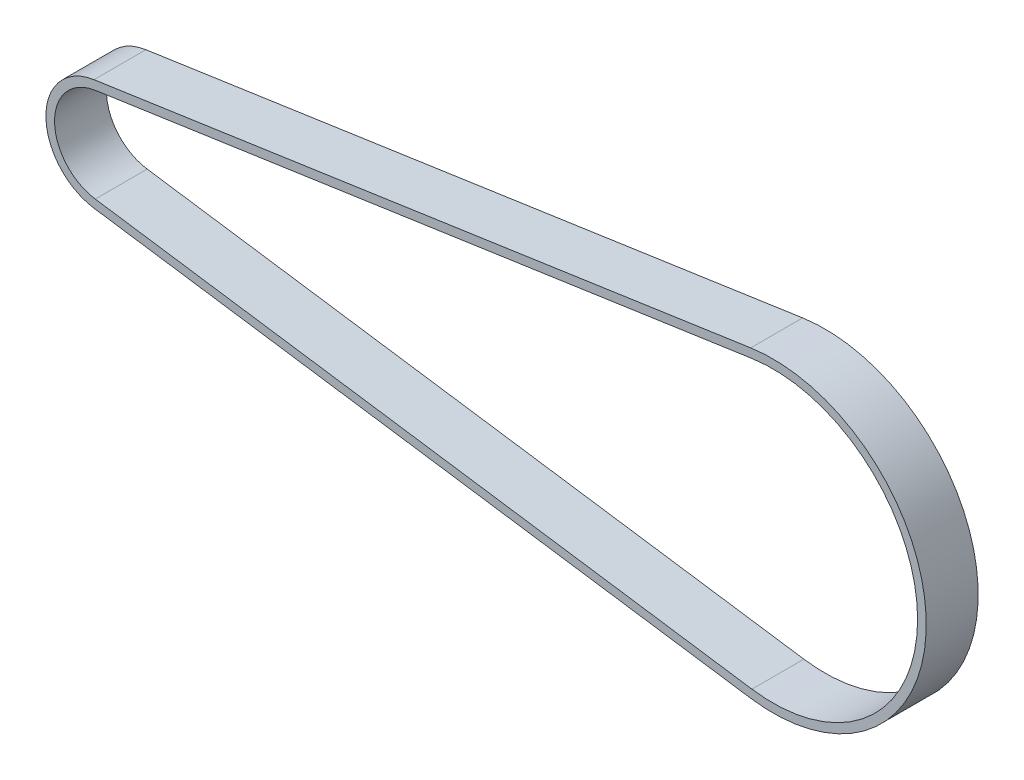
ISO-10303-21;
HEADER;
FILE_DESCRIPTION(('STEP AP214'),'2;1');
FILE_NAME('part.step','',(''),(''),'','','');
FILE_SCHEMA(('AUTOMOTIVE_DESIGN { 1 0 10303 214 1 1 1 1 }'));
ENDSEC;
DATA;
#1=APPLICATION_CONTEXT('core data for automotive mechanical design processes');
#2=APPLICATION_PROTOCOL_DEFINITION('international standard','automotive_design',2000,#1);
#3=PRODUCT_CONTEXT('',#1,'mechanical');
#4=PRODUCT('Part','Part','',(#3));
#5=PRODUCT_RELATED_PRODUCT_CATEGORY('part','',(#4));
#6=PRODUCT_DEFINITION_FORMATION('','',#4);
#7=PRODUCT_DEFINITION_CONTEXT('part definition',#1,'design');
#8=PRODUCT_DEFINITION('design','',#6,#7);
#9=PRODUCT_DEFINITION_SHAPE('','',#8);
#10=(LENGTH_UNIT() NAMED_UNIT(*) SI_UNIT(.MILLI.,.METRE.));
#11=(NAMED_UNIT(*) PLANE_ANGLE_UNIT() SI_UNIT($,.RADIAN.));
#12=(NAMED_UNIT(*) SI_UNIT($,.STERADIAN.) SOLID_ANGLE_UNIT());
#13=UNCERTAINTY_MEASURE_WITH_UNIT(LENGTH_MEASURE(1.E-05),#10,'distance_accuracy_value','');
#14=(GEOMETRIC_REPRESENTATION_CONTEXT(3) GLOBAL_UNCERTAINTY_ASSIGNED_CONTEXT((#13)) GLOBAL_UNIT_ASSIGNED_CONTEXT((#10,
#11,#12)) REPRESENTATION_CONTEXT('',''));
#15=CARTESIAN_POINT('',(0.,0.,0.));
#16=DIRECTION('',(0.,0.,1.));
#17=DIRECTION('',(1.,0.,0.));
#18=AXIS2_PLACEMENT_3D('',#15,#16,#17);
#19=CARTESIAN_POINT('',(0.,0.,6.));
#20=DIRECTION('',(0.,0.,1.));
#21=DIRECTION('',(1.,0.,0.));
#22=AXIS2_PLACEMENT_3D('',#19,#20,#21);
#23=PLANE('',#22);
#24=CARTESIAN_POINT('',(0.,0.,6.));
#25=DIRECTION('',(0.,0.,1.));
#26=DIRECTION('',(1.,0.,0.));
#27=AXIS2_PLACEMENT_3D('',#24,#25,#26);
#28=CIRCLE('',#27,6.5);
#29=CARTESIAN_POINT('',(-0.941032258064516,6.43152068248886,6.));
#30=VERTEX_POINT('',#29);
#31=CARTESIAN_POINT('',(-0.941032258064516,-6.43152068248886,6.));
#32=VERTEX_POINT('',#31);
#33=EDGE_CURVE('E153',#30,#32,#28,.T.);
#34=ORIENTED_EDGE('',*,*,#33,.T.);
#35=DIRECTION('',(0.989464720382902,-0.144774193548387,0.));
#36=VECTOR('',#35,1.);
#37=CARTESIAN_POINT('',(-0.941032258064516,-6.43152068248886,6.));
#38=LINE('',#37,#36);
#39=CARTESIAN_POINT('',(74.9346012903226,-17.533314845185,6.));
#40=VERTEX_POINT('',#39);
#41=EDGE_CURVE('E157',#32,#40,#38,.T.);
#42=ORIENTED_EDGE('',*,*,#41,.T.);
#43=CARTESIAN_POINT('',(77.5,0.,6.));
#44=DIRECTION('',(0.,0.,1.));
#45=DIRECTION('',(1.,0.,0.));
#46=AXIS2_PLACEMENT_3D('',#43,#44,#45);
#47=CIRCLE('',#46,17.72);
#48=CARTESIAN_POINT('',(74.9346012903226,17.533314845185,6.));
#49=VERTEX_POINT('',#48);
#50=EDGE_CURVE('E161',#40,#49,#47,.T.);
#51=ORIENTED_EDGE('',*,*,#50,.T.);
#52=DIRECTION('',(-0.989464720382902,-0.144774193548387,0.));
#53=VECTOR('',#52,1.);
#54=CARTESIAN_POINT('',(-0.941032258064516,6.43152068248886,6.));
#55=LINE('',#54,#53);
#56=EDGE_CURVE('E164',#49,#30,#55,.T.);
#57=ORIENTED_EDGE('',*,*,#56,.T.);
#58=EDGE_LOOP('',(#34,#42,#51,#57));
#59=FACE_BOUND('',#58,.T.);
#60=DIRECTION('',(0.989464720382902,-0.144774193548387,0.));
#61=VECTOR('',#60,1.);
#62=CARTESIAN_POINT('',(-0.796258064516129,-5.44205596210596,6.));
#63=LINE('',#62,#61);
#64=CARTESIAN_POINT('',(-0.796258064516129,-5.44205596210596,6.));
#65=VERTEX_POINT('',#64);
#66=CARTESIAN_POINT('',(75.079375483871,-16.5438501248021,6.));
#67=VERTEX_POINT('',#66);
#68=EDGE_CURVE('E114',#65,#67,#63,.T.);
#69=ORIENTED_EDGE('',*,*,#68,.F.);
#70=CARTESIAN_POINT('',(0.,0.,6.));
#71=DIRECTION('',(0.,0.,1.));
#72=DIRECTION('',(1.,0.,0.));
#73=AXIS2_PLACEMENT_3D('',#70,#71,#72);
#74=CIRCLE('',#73,5.5);
#75=CARTESIAN_POINT('',(-0.796258064516129,5.44205596210596,6.));
#76=VERTEX_POINT('',#75);
#77=EDGE_CURVE('E105',#76,#65,#74,.T.);
#78=ORIENTED_EDGE('',*,*,#77,.F.);
#79=DIRECTION('',(-0.989464720382902,-0.144774193548387,0.));
#80=VECTOR('',#79,1.);
#81=CARTESIAN_POINT('',(-0.796258064516129,5.44205596210596,6.));
#82=LINE('',#81,#80);
#83=CARTESIAN_POINT('',(75.079375483871,16.5438501248021,6.));
#84=VERTEX_POINT('',#83);
#85=EDGE_CURVE('E131',#84,#76,#82,.T.);
#86=ORIENTED_EDGE('',*,*,#85,.F.);
#87=CARTESIAN_POINT('',(77.5,0.,6.));
#88=DIRECTION('',(0.,0.,1.));
#89=DIRECTION('',(1.,0.,0.));
#90=AXIS2_PLACEMENT_3D('',#87,#88,#89);
#91=CIRCLE('',#90,16.72);
#92=EDGE_CURVE('E127',#67,#84,#91,.T.);
#93=ORIENTED_EDGE('',*,*,#92,.F.);
#94=EDGE_LOOP('',(#69,#78,#86,#93));
#95=FACE_BOUND('',#94,.T.);
#96=ADVANCED_FACE('F39',(#59,#95),#23,.T.);
#97=CARTESIAN_POINT('',(0.,0.,0.));
#98=DIRECTION('',(0.,0.,1.));
#99=DIRECTION('',(1.,0.,0.));
#100=AXIS2_PLACEMENT_3D('',#97,#98,#99);
#101=PLANE('',#100);
#102=CARTESIAN_POINT('',(0.,0.,0.));
#103=DIRECTION('',(0.,0.,1.));
#104=DIRECTION('',(1.,0.,0.));
#105=AXIS2_PLACEMENT_3D('',#102,#103,#104);
#106=CIRCLE('',#105,6.5);
#107=CARTESIAN_POINT('',(-0.941032258064516,6.43152068248886,0.));
#108=VERTEX_POINT('',#107);
#109=CARTESIAN_POINT('',(-0.941032258064516,-6.43152068248886,0.));
#110=VERTEX_POINT('',#109);
#111=EDGE_CURVE('E123',#108,#110,#106,.T.);
#112=ORIENTED_EDGE('',*,*,#111,.F.);
#113=DIRECTION('',(-0.989464720382902,-0.144774193548387,0.));
#114=VECTOR('',#113,1.);
#115=CARTESIAN_POINT('',(-0.941032258064516,6.43152068248886,0.));
#116=LINE('',#115,#114);
#117=CARTESIAN_POINT('',(74.9346012903226,17.533314845185,0.));
#118=VERTEX_POINT('',#117);
#119=EDGE_CURVE('E158',#118,#108,#116,.T.);
#120=ORIENTED_EDGE('',*,*,#119,.F.);
#121=CARTESIAN_POINT('',(77.5,0.,0.));
#122=DIRECTION('',(0.,0.,1.));
#123=DIRECTION('',(1.,0.,0.));
#124=AXIS2_PLACEMENT_3D('',#121,#122,#123);
#125=CIRCLE('',#124,17.72);
#126=CARTESIAN_POINT('',(74.9346012903226,-17.533314845185,0.));
#127=VERTEX_POINT('',#126);
#128=EDGE_CURVE('E174',#127,#118,#125,.T.);
#129=ORIENTED_EDGE('',*,*,#128,.F.);
#130=DIRECTION('',(0.989464720382902,-0.144774193548387,0.));
#131=VECTOR('',#130,1.);
#132=CARTESIAN_POINT('',(-0.941032258064516,-6.43152068248886,0.));
#133=LINE('',#132,#131);
#134=EDGE_CURVE('E171',#110,#127,#133,.T.);
#135=ORIENTED_EDGE('',*,*,#134,.F.);
#136=EDGE_LOOP('',(#112,#120,#129,#135));
#137=FACE_BOUND('',#136,.T.);
#138=CARTESIAN_POINT('',(0.,0.,0.));
#139=DIRECTION('',(0.,0.,1.));
#140=DIRECTION('',(1.,0.,0.));
#141=AXIS2_PLACEMENT_3D('',#138,#139,#140);
#142=CIRCLE('',#141,5.5);
#143=CARTESIAN_POINT('',(-0.796258064516129,5.44205596210596,0.));
#144=VERTEX_POINT('',#143);
#145=CARTESIAN_POINT('',(-0.796258064516129,-5.44205596210596,0.));
#146=VERTEX_POINT('',#145);
#147=EDGE_CURVE('E63',#144,#146,#142,.T.);
#148=ORIENTED_EDGE('',*,*,#147,.T.);
#149=DIRECTION('',(0.989464720382902,-0.144774193548387,0.));
#150=VECTOR('',#149,1.);
#151=CARTESIAN_POINT('',(-0.796258064516129,-5.44205596210596,0.));
#152=LINE('',#151,#150);
#153=CARTESIAN_POINT('',(75.079375483871,-16.5438501248021,0.));
#154=VERTEX_POINT('',#153);
#155=EDGE_CURVE('E121',#146,#154,#152,.T.);
#156=ORIENTED_EDGE('',*,*,#155,.T.);
#157=CARTESIAN_POINT('',(77.5,0.,0.));
#158=DIRECTION('',(0.,0.,1.));
#159=DIRECTION('',(1.,0.,0.));
#160=AXIS2_PLACEMENT_3D('',#157,#158,#159);
#161=CIRCLE('',#160,16.72);
#162=CARTESIAN_POINT('',(75.079375483871,16.5438501248021,0.));
#163=VERTEX_POINT('',#162);
#164=EDGE_CURVE('E140',#154,#163,#161,.T.);
#165=ORIENTED_EDGE('',*,*,#164,.T.);
#166=DIRECTION('',(-0.989464720382902,-0.144774193548387,0.));
#167=VECTOR('',#166,1.);
#168=CARTESIAN_POINT('',(-0.796258064516129,5.44205596210596,0.));
#169=LINE('',#168,#167);
#170=EDGE_CURVE('E115',#163,#144,#169,.T.);
#171=ORIENTED_EDGE('',*,*,#170,.T.);
#172=EDGE_LOOP('',(#148,#156,#165,#171));
#173=FACE_BOUND('',#172,.T.);
#174=ADVANCED_FACE('F197',(#137,#173),#101,.F.);
#175=CARTESIAN_POINT('',(0.,0.,6.));
#176=DIRECTION('',(0.,0.,-1.));
#177=DIRECTION('',(-1.,0.,0.));
#178=AXIS2_PLACEMENT_3D('',#175,#176,#177);
#179=CYLINDRICAL_SURFACE('',#178,6.5);
#180=ORIENTED_EDGE('',*,*,#111,.T.);
#181=DIRECTION('',(0.,0.,-1.));
#182=VECTOR('',#181,1.);
#183=CARTESIAN_POINT('',(-0.941032258064516,-6.43152068248886,6.));
#184=LINE('',#183,#182);
#185=EDGE_CURVE('E11',#32,#110,#184,.T.);
#186=ORIENTED_EDGE('',*,*,#185,.F.);
#187=ORIENTED_EDGE('',*,*,#33,.F.);
#188=DIRECTION('',(0.,0.,-1.));
#189=VECTOR('',#188,1.);
#190=CARTESIAN_POINT('',(-0.941032258064516,6.43152068248886,6.));
#191=LINE('',#190,#189);
#192=EDGE_CURVE('E167',#30,#108,#191,.T.);
#193=ORIENTED_EDGE('',*,*,#192,.T.);
#194=EDGE_LOOP('',(#180,#186,#187,#193));
#195=FACE_BOUND('',#194,.T.);
#196=ADVANCED_FACE('F41',(#195),#179,.T.);
#197=CARTESIAN_POINT('',(-0.941032258064516,-6.43152068248886,6.));
#198=DIRECTION('',(0.144774193548387,0.989464720382902,0.));
#199=DIRECTION('',(-0.989464720382902,0.144774193548387,0.));
#200=AXIS2_PLACEMENT_3D('',#197,#198,#199);
#201=PLANE('',#200);
#202=ORIENTED_EDGE('',*,*,#134,.T.);
#203=DIRECTION('',(0.,0.,-1.));
#204=VECTOR('',#203,1.);
#205=CARTESIAN_POINT('',(74.9346012903226,-17.533314845185,6.));
#206=LINE('',#205,#204);
#207=EDGE_CURVE('E48',#40,#127,#206,.T.);
#208=ORIENTED_EDGE('',*,*,#207,.F.);
#209=ORIENTED_EDGE('',*,*,#41,.F.);
#210=ORIENTED_EDGE('',*,*,#185,.T.);
#211=EDGE_LOOP('',(#202,#208,#209,#210));
#212=FACE_BOUND('',#211,.T.);
#213=ADVANCED_FACE('F207',(#212),#201,.F.);
#214=CARTESIAN_POINT('',(77.5,0.,6.));
#215=DIRECTION('',(0.,0.,-1.));
#216=DIRECTION('',(-1.,0.,0.));
#217=AXIS2_PLACEMENT_3D('',#214,#215,#216);
#218=CYLINDRICAL_SURFACE('',#217,17.72);
#219=ORIENTED_EDGE('',*,*,#128,.T.);
#220=DIRECTION('',(0.,0.,-1.));
#221=VECTOR('',#220,1.);
#222=CARTESIAN_POINT('',(74.9346012903226,17.533314845185,6.));
#223=LINE('',#222,#221);
#224=EDGE_CURVE('E182',#49,#118,#223,.T.);
#225=ORIENTED_EDGE('',*,*,#224,.F.);
#226=ORIENTED_EDGE('',*,*,#50,.F.);
#227=ORIENTED_EDGE('',*,*,#207,.T.);
#228=EDGE_LOOP('',(#219,#225,#226,#227));
#229=FACE_BOUND('',#228,.T.);
#230=ADVANCED_FACE('F191',(#229),#218,.T.);
#231=CARTESIAN_POINT('',(-0.941032258064516,6.43152068248886,6.));
#232=DIRECTION('',(0.144774193548387,-0.989464720382902,0.));
#233=DIRECTION('',(0.989464720382902,0.144774193548387,0.));
#234=AXIS2_PLACEMENT_3D('',#231,#232,#233);
#235=PLANE('',#234);
#236=ORIENTED_EDGE('',*,*,#119,.T.);
#237=ORIENTED_EDGE('',*,*,#192,.F.);
#238=ORIENTED_EDGE('',*,*,#56,.F.);
#239=ORIENTED_EDGE('',*,*,#224,.T.);
#240=EDGE_LOOP('',(#236,#237,#238,#239));
#241=FACE_BOUND('',#240,.T.);
#242=ADVANCED_FACE('F201',(#241),#235,.F.);
#243=CARTESIAN_POINT('',(0.,0.,6.));
#244=DIRECTION('',(0.,0.,-1.));
#245=DIRECTION('',(-1.,0.,0.));
#246=AXIS2_PLACEMENT_3D('',#243,#244,#245);
#247=CYLINDRICAL_SURFACE('',#246,5.5);
#248=ORIENTED_EDGE('',*,*,#147,.F.);
#249=DIRECTION('',(0.,0.,-1.));
#250=VECTOR('',#249,1.);
#251=CARTESIAN_POINT('',(-0.796258064516129,5.44205596210596,6.));
#252=LINE('',#251,#250);
#253=EDGE_CURVE('E109',#76,#144,#252,.T.);
#254=ORIENTED_EDGE('',*,*,#253,.F.);
#255=ORIENTED_EDGE('',*,*,#77,.T.);
#256=DIRECTION('',(0.,0.,-1.));
#257=VECTOR('',#256,1.);
#258=CARTESIAN_POINT('',(-0.796258064516129,-5.44205596210596,6.));
#259=LINE('',#258,#257);
#260=EDGE_CURVE('E108',#65,#146,#259,.T.);
#261=ORIENTED_EDGE('',*,*,#260,.T.);
#262=EDGE_LOOP('',(#248,#254,#255,#261));
#263=FACE_BOUND('',#262,.T.);
#264=ADVANCED_FACE('F107',(#263),#247,.F.);
#265=CARTESIAN_POINT('',(-0.796258064516129,-5.44205596210596,6.));
#266=DIRECTION('',(0.144774193548387,0.989464720382902,0.));
#267=DIRECTION('',(-0.989464720382902,0.144774193548387,0.));
#268=AXIS2_PLACEMENT_3D('',#265,#266,#267);
#269=PLANE('',#268);
#270=ORIENTED_EDGE('',*,*,#155,.F.);
#271=ORIENTED_EDGE('',*,*,#260,.F.);
#272=ORIENTED_EDGE('',*,*,#68,.T.);
#273=DIRECTION('',(0.,0.,-1.));
#274=VECTOR('',#273,1.);
#275=CARTESIAN_POINT('',(75.079375483871,-16.5438501248021,6.));
#276=LINE('',#275,#274);
#277=EDGE_CURVE('E124',#67,#154,#276,.T.);
#278=ORIENTED_EDGE('',*,*,#277,.T.);
#279=EDGE_LOOP('',(#270,#271,#272,#278));
#280=FACE_BOUND('',#279,.T.);
#281=ADVANCED_FACE('F118',(#280),#269,.T.);
#282=CARTESIAN_POINT('',(77.5,0.,6.));
#283=DIRECTION('',(0.,0.,-1.));
#284=DIRECTION('',(-1.,0.,0.));
#285=AXIS2_PLACEMENT_3D('',#282,#283,#284);
#286=CYLINDRICAL_SURFACE('',#285,16.72);
#287=ORIENTED_EDGE('',*,*,#164,.F.);
#288=ORIENTED_EDGE('',*,*,#277,.F.);
#289=ORIENTED_EDGE('',*,*,#92,.T.);
#290=DIRECTION('',(0.,0.,-1.));
#291=VECTOR('',#290,1.);
#292=CARTESIAN_POINT('',(75.079375483871,16.5438501248021,6.));
#293=LINE('',#292,#291);
#294=EDGE_CURVE('E55',#84,#163,#293,.T.);
#295=ORIENTED_EDGE('',*,*,#294,.T.);
#296=EDGE_LOOP('',(#287,#288,#289,#295));
#297=FACE_BOUND('',#296,.T.);
#298=ADVANCED_FACE('F230',(#297),#286,.F.);
#299=CARTESIAN_POINT('',(-0.796258064516129,5.44205596210596,6.));
#300=DIRECTION('',(0.144774193548387,-0.989464720382902,0.));
#301=DIRECTION('',(0.989464720382902,0.144774193548387,0.));
#302=AXIS2_PLACEMENT_3D('',#299,#300,#301);
#303=PLANE('',#302);
#304=ORIENTED_EDGE('',*,*,#170,.F.);
#305=ORIENTED_EDGE('',*,*,#294,.F.);
#306=ORIENTED_EDGE('',*,*,#85,.T.);
#307=ORIENTED_EDGE('',*,*,#253,.T.);
#308=EDGE_LOOP('',(#304,#305,#306,#307));
#309=FACE_BOUND('',#308,.T.);
#310=ADVANCED_FACE('F234',(#309),#303,.T.);
#311=CLOSED_SHELL('',(#96,#174,#196,#213,#230,#242,#264,#281,#298,#310));
#312=MANIFOLD_SOLID_BREP('B2',#311);
#313=ADVANCED_BREP_SHAPE_REPRESENTATION('',(#18,#312),#14);
#314=SHAPE_DEFINITION_REPRESENTATION(#9,#313);
ENDSEC;
END-ISO-10303-21;
